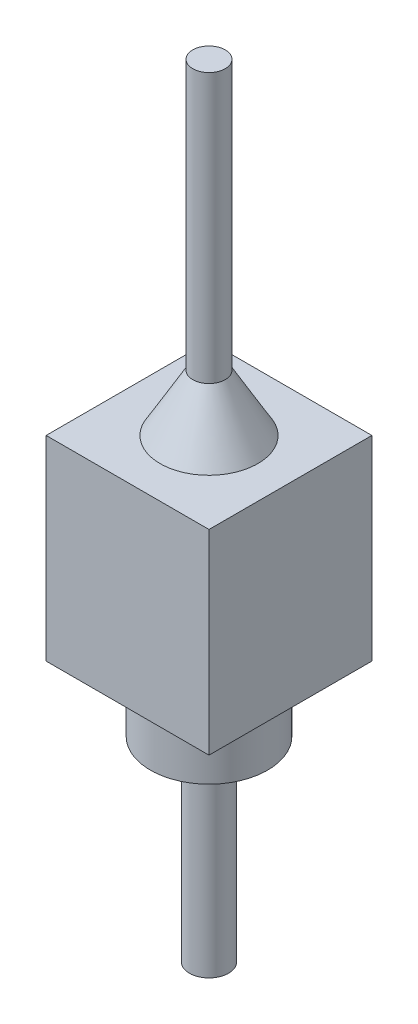
ISO-10303-21;
HEADER;
FILE_DESCRIPTION(('STEP AP214'),'2;1');
FILE_NAME('part.step','',(''),(''),'','','');
FILE_SCHEMA(('AUTOMOTIVE_DESIGN { 1 0 10303 214 1 1 1 1 }'));
ENDSEC;
DATA;
#1=APPLICATION_CONTEXT('core data for automotive mechanical design processes');
#2=APPLICATION_PROTOCOL_DEFINITION('international standard','automotive_design',2000,#1);
#3=PRODUCT_CONTEXT('',#1,'mechanical');
#4=PRODUCT('Part','Part','',(#3));
#5=PRODUCT_RELATED_PRODUCT_CATEGORY('part','',(#4));
#6=PRODUCT_DEFINITION_FORMATION('','',#4);
#7=PRODUCT_DEFINITION_CONTEXT('part definition',#1,'design');
#8=PRODUCT_DEFINITION('design','',#6,#7);
#9=PRODUCT_DEFINITION_SHAPE('','',#8);
#10=(LENGTH_UNIT() NAMED_UNIT(*) SI_UNIT(.MILLI.,.METRE.));
#11=(NAMED_UNIT(*) PLANE_ANGLE_UNIT() SI_UNIT($,.RADIAN.));
#12=(NAMED_UNIT(*) SI_UNIT($,.STERADIAN.) SOLID_ANGLE_UNIT());
#13=UNCERTAINTY_MEASURE_WITH_UNIT(LENGTH_MEASURE(1.E-05),#10,'distance_accuracy_value','');
#14=(GEOMETRIC_REPRESENTATION_CONTEXT(3) GLOBAL_UNCERTAINTY_ASSIGNED_CONTEXT((#13)) GLOBAL_UNIT_ASSIGNED_CONTEXT((#10,
#11,#12)) REPRESENTATION_CONTEXT('',''));
#15=CARTESIAN_POINT('',(0.,0.,0.));
#16=DIRECTION('',(0.,0.,1.));
#17=DIRECTION('',(1.,0.,0.));
#18=AXIS2_PLACEMENT_3D('',#15,#16,#17);
#19=CARTESIAN_POINT('',(-1.25,3.,-1.25));
#20=DIRECTION('',(1.,0.,0.));
#21=DIRECTION('',(0.,0.,-1.));
#22=AXIS2_PLACEMENT_3D('',#19,#20,#21);
#23=PLANE('',#22);
#24=DIRECTION('',(0.,0.,1.));
#25=VECTOR('',#24,1.);
#26=CARTESIAN_POINT('',(-1.25,0.,-1.25));
#27=LINE('',#26,#25);
#28=CARTESIAN_POINT('',(-1.25,0.,-1.25));
#29=VERTEX_POINT('',#28);
#30=CARTESIAN_POINT('',(-1.25,0.,1.25));
#31=VERTEX_POINT('',#30);
#32=EDGE_CURVE('E103',#29,#31,#27,.T.);
#33=ORIENTED_EDGE('',*,*,#32,.T.);
#34=DIRECTION('',(0.,-1.,0.));
#35=VECTOR('',#34,1.);
#36=CARTESIAN_POINT('',(-1.25,3.,1.25));
#37=LINE('',#36,#35);
#38=CARTESIAN_POINT('',(-1.25,3.,1.25));
#39=VERTEX_POINT('',#38);
#40=EDGE_CURVE('E94',#39,#31,#37,.T.);
#41=ORIENTED_EDGE('',*,*,#40,.F.);
#42=DIRECTION('',(0.,0.,1.));
#43=VECTOR('',#42,1.);
#44=CARTESIAN_POINT('',(-1.25,3.,-1.25));
#45=LINE('',#44,#43);
#46=CARTESIAN_POINT('',(-1.25,3.,-1.25));
#47=VERTEX_POINT('',#46);
#48=EDGE_CURVE('E88',#47,#39,#45,.T.);
#49=ORIENTED_EDGE('',*,*,#48,.F.);
#50=DIRECTION('',(0.,-1.,0.));
#51=VECTOR('',#50,1.);
#52=CARTESIAN_POINT('',(-1.25,3.,-1.25));
#53=LINE('',#52,#51);
#54=EDGE_CURVE('E99',#47,#29,#53,.T.);
#55=ORIENTED_EDGE('',*,*,#54,.T.);
#56=EDGE_LOOP('',(#33,#41,#49,#55));
#57=FACE_BOUND('',#56,.T.);
#58=ADVANCED_FACE('F35',(#57),#23,.F.);
#59=CARTESIAN_POINT('',(1.25,3.,1.25));
#60=DIRECTION('',(0.,0.,-1.));
#61=DIRECTION('',(-1.,0.,0.));
#62=AXIS2_PLACEMENT_3D('',#59,#60,#61);
#63=PLANE('',#62);
#64=DIRECTION('',(1.,0.,0.));
#65=VECTOR('',#64,1.);
#66=CARTESIAN_POINT('',(1.25,0.,1.25));
#67=LINE('',#66,#65);
#68=CARTESIAN_POINT('',(1.25,0.,1.25));
#69=VERTEX_POINT('',#68);
#70=EDGE_CURVE('E93',#31,#69,#67,.T.);
#71=ORIENTED_EDGE('',*,*,#70,.T.);
#72=DIRECTION('',(0.,-1.,0.));
#73=VECTOR('',#72,1.);
#74=CARTESIAN_POINT('',(1.25,3.,1.25));
#75=LINE('',#74,#73);
#76=CARTESIAN_POINT('',(1.25,3.,1.25));
#77=VERTEX_POINT('',#76);
#78=EDGE_CURVE('E91',#77,#69,#75,.T.);
#79=ORIENTED_EDGE('',*,*,#78,.F.);
#80=DIRECTION('',(1.,0.,0.));
#81=VECTOR('',#80,1.);
#82=CARTESIAN_POINT('',(1.25,3.,1.25));
#83=LINE('',#82,#81);
#84=EDGE_CURVE('E83',#39,#77,#83,.T.);
#85=ORIENTED_EDGE('',*,*,#84,.F.);
#86=ORIENTED_EDGE('',*,*,#40,.T.);
#87=EDGE_LOOP('',(#71,#79,#85,#86));
#88=FACE_BOUND('',#87,.T.);
#89=ADVANCED_FACE('F92',(#88),#63,.F.);
#90=CARTESIAN_POINT('',(1.25,3.,-1.25));
#91=DIRECTION('',(-1.,0.,0.));
#92=DIRECTION('',(0.,0.,1.));
#93=AXIS2_PLACEMENT_3D('',#90,#91,#92);
#94=PLANE('',#93);
#95=DIRECTION('',(0.,0.,-1.));
#96=VECTOR('',#95,1.);
#97=CARTESIAN_POINT('',(1.25,0.,-1.25));
#98=LINE('',#97,#96);
#99=CARTESIAN_POINT('',(1.25,0.,-1.25));
#100=VERTEX_POINT('',#99);
#101=EDGE_CURVE('E69',#69,#100,#98,.T.);
#102=ORIENTED_EDGE('',*,*,#101,.T.);
#103=DIRECTION('',(0.,-1.,0.));
#104=VECTOR('',#103,1.);
#105=CARTESIAN_POINT('',(1.25,3.,-1.25));
#106=LINE('',#105,#104);
#107=CARTESIAN_POINT('',(1.25,3.,-1.25));
#108=VERTEX_POINT('',#107);
#109=EDGE_CURVE('E95',#108,#100,#106,.T.);
#110=ORIENTED_EDGE('',*,*,#109,.F.);
#111=DIRECTION('',(0.,0.,-1.));
#112=VECTOR('',#111,1.);
#113=CARTESIAN_POINT('',(1.25,3.,-1.25));
#114=LINE('',#113,#112);
#115=EDGE_CURVE('E86',#77,#108,#114,.T.);
#116=ORIENTED_EDGE('',*,*,#115,.F.);
#117=ORIENTED_EDGE('',*,*,#78,.T.);
#118=EDGE_LOOP('',(#102,#110,#116,#117));
#119=FACE_BOUND('',#118,.T.);
#120=ADVANCED_FACE('F97',(#119),#94,.F.);
#121=CARTESIAN_POINT('',(1.25,3.,-1.25));
#122=DIRECTION('',(0.,0.,1.));
#123=DIRECTION('',(1.,0.,0.));
#124=AXIS2_PLACEMENT_3D('',#121,#122,#123);
#125=PLANE('',#124);
#126=DIRECTION('',(-1.,0.,0.));
#127=VECTOR('',#126,1.);
#128=CARTESIAN_POINT('',(1.25,0.,-1.25));
#129=LINE('',#128,#127);
#130=EDGE_CURVE('E75',#100,#29,#129,.T.);
#131=ORIENTED_EDGE('',*,*,#130,.T.);
#132=ORIENTED_EDGE('',*,*,#54,.F.);
#133=DIRECTION('',(-1.,0.,0.));
#134=VECTOR('',#133,1.);
#135=CARTESIAN_POINT('',(1.25,3.,-1.25));
#136=LINE('',#135,#134);
#137=EDGE_CURVE('E52',#108,#47,#136,.T.);
#138=ORIENTED_EDGE('',*,*,#137,.F.);
#139=ORIENTED_EDGE('',*,*,#109,.T.);
#140=EDGE_LOOP('',(#131,#132,#138,#139));
#141=FACE_BOUND('',#140,.T.);
#142=ADVANCED_FACE('F159',(#141),#125,.F.);
#143=CARTESIAN_POINT('',(0.,3.,0.));
#144=DIRECTION('',(0.,-1.,0.));
#145=DIRECTION('',(0.,0.,-1.));
#146=AXIS2_PLACEMENT_3D('',#143,#144,#145);
#147=PLANE('',#146);
#148=CARTESIAN_POINT('',(0.,3.,0.));
#149=DIRECTION('',(0.,-1.,0.));
#150=DIRECTION('',(0.,0.,-1.));
#151=AXIS2_PLACEMENT_3D('',#148,#149,#150);
#152=CIRCLE('',#151,0.749999999999998);
#153=CARTESIAN_POINT('',(0.,3.,-0.749999999999998));
#154=VERTEX_POINT('',#153);
#155=EDGE_CURVE('E11',#154,#154,#152,.T.);
#156=ORIENTED_EDGE('',*,*,#155,.T.);
#157=EDGE_LOOP('',(#156));
#158=FACE_BOUND('',#157,.T.);
#159=ORIENTED_EDGE('',*,*,#48,.T.);
#160=ORIENTED_EDGE('',*,*,#84,.T.);
#161=ORIENTED_EDGE('',*,*,#115,.T.);
#162=ORIENTED_EDGE('',*,*,#137,.T.);
#163=EDGE_LOOP('',(#159,#160,#161,#162));
#164=FACE_BOUND('',#163,.T.);
#165=ADVANCED_FACE('F84',(#158,#164),#147,.F.);
#166=CARTESIAN_POINT('',(0.,0.,0.));
#167=DIRECTION('',(0.,-1.,0.));
#168=DIRECTION('',(0.,0.,-1.));
#169=AXIS2_PLACEMENT_3D('',#166,#167,#168);
#170=PLANE('',#169);
#171=CARTESIAN_POINT('',(0.,0.,0.));
#172=DIRECTION('',(0.,-1.,0.));
#173=DIRECTION('',(0.,0.,-1.));
#174=AXIS2_PLACEMENT_3D('',#171,#172,#173);
#175=CIRCLE('',#174,0.9);
#176=CARTESIAN_POINT('',(0.,0.,-0.9));
#177=VERTEX_POINT('',#176);
#178=EDGE_CURVE('E112',#177,#177,#175,.T.);
#179=ORIENTED_EDGE('',*,*,#178,.F.);
#180=EDGE_LOOP('',(#179));
#181=FACE_BOUND('',#180,.T.);
#182=ORIENTED_EDGE('',*,*,#32,.F.);
#183=ORIENTED_EDGE('',*,*,#130,.F.);
#184=ORIENTED_EDGE('',*,*,#101,.F.);
#185=ORIENTED_EDGE('',*,*,#70,.F.);
#186=EDGE_LOOP('',(#182,#183,#184,#185));
#187=FACE_BOUND('',#186,.T.);
#188=ADVANCED_FACE('F162',(#181,#187),#170,.T.);
#189=CARTESIAN_POINT('',(0.,-1.,0.));
#190=DIRECTION('',(0.,1.,0.));
#191=DIRECTION('',(0.,0.,1.));
#192=AXIS2_PLACEMENT_3D('',#189,#190,#191);
#193=CYLINDRICAL_SURFACE('',#192,0.9);
#194=CARTESIAN_POINT('',(0.,-1.,0.));
#195=DIRECTION('',(0.,-1.,0.));
#196=DIRECTION('',(0.,0.,-1.));
#197=AXIS2_PLACEMENT_3D('',#194,#195,#196);
#198=CIRCLE('',#197,0.9);
#199=CARTESIAN_POINT('',(0.,-1.,-0.9));
#200=VERTEX_POINT('',#199);
#201=EDGE_CURVE('E106',#200,#200,#198,.T.);
#202=ORIENTED_EDGE('',*,*,#201,.F.);
#203=EDGE_LOOP('',(#202));
#204=FACE_BOUND('',#203,.T.);
#205=ORIENTED_EDGE('',*,*,#178,.T.);
#206=EDGE_LOOP('',(#205));
#207=FACE_BOUND('',#206,.T.);
#208=ADVANCED_FACE('F165',(#204,#207),#193,.T.);
#209=CARTESIAN_POINT('',(0.,-1.,0.));
#210=DIRECTION('',(0.,-1.,0.));
#211=DIRECTION('',(0.,0.,-1.));
#212=AXIS2_PLACEMENT_3D('',#209,#210,#211);
#213=PLANE('',#212);
#214=CARTESIAN_POINT('',(0.,-1.,0.));
#215=DIRECTION('',(0.,-1.,0.));
#216=DIRECTION('',(0.,0.,-1.));
#217=AXIS2_PLACEMENT_3D('',#214,#215,#216);
#218=CIRCLE('',#217,0.3);
#219=CARTESIAN_POINT('',(0.,-1.,-0.3));
#220=VERTEX_POINT('',#219);
#221=EDGE_CURVE('E114',#220,#220,#218,.T.);
#222=ORIENTED_EDGE('',*,*,#221,.F.);
#223=EDGE_LOOP('',(#222));
#224=FACE_BOUND('',#223,.T.);
#225=ORIENTED_EDGE('',*,*,#201,.T.);
#226=EDGE_LOOP('',(#225));
#227=FACE_BOUND('',#226,.T.);
#228=ADVANCED_FACE('F172',(#224,#227),#213,.T.);
#229=CARTESIAN_POINT('',(0.,-4.,0.));
#230=DIRECTION('',(0.,1.,0.));
#231=DIRECTION('',(0.,0.,1.));
#232=AXIS2_PLACEMENT_3D('',#229,#230,#231);
#233=CYLINDRICAL_SURFACE('',#232,0.3);
#234=CARTESIAN_POINT('',(0.,-4.,0.));
#235=DIRECTION('',(0.,-1.,0.));
#236=DIRECTION('',(0.,0.,-1.));
#237=AXIS2_PLACEMENT_3D('',#234,#235,#236);
#238=CIRCLE('',#237,0.3);
#239=CARTESIAN_POINT('',(0.,-4.,-0.3));
#240=VERTEX_POINT('',#239);
#241=EDGE_CURVE('E125',#240,#240,#238,.T.);
#242=ORIENTED_EDGE('',*,*,#241,.F.);
#243=EDGE_LOOP('',(#242));
#244=FACE_BOUND('',#243,.T.);
#245=ORIENTED_EDGE('',*,*,#221,.T.);
#246=EDGE_LOOP('',(#245));
#247=FACE_BOUND('',#246,.T.);
#248=ADVANCED_FACE('F148',(#244,#247),#233,.T.);
#249=CARTESIAN_POINT('',(0.,-4.,0.));
#250=DIRECTION('',(0.,-1.,0.));
#251=DIRECTION('',(0.,0.,-1.));
#252=AXIS2_PLACEMENT_3D('',#249,#250,#251);
#253=PLANE('',#252);
#254=ORIENTED_EDGE('',*,*,#241,.T.);
#255=EDGE_LOOP('',(#254));
#256=FACE_BOUND('',#255,.T.);
#257=ADVANCED_FACE('F141',(#256),#253,.T.);
#258=CARTESIAN_POINT('',(0.,8.,0.));
#259=DIRECTION('',(0.,-1.,0.));
#260=DIRECTION('',(0.,0.,-1.));
#261=AXIS2_PLACEMENT_3D('',#258,#259,#260);
#262=CYLINDRICAL_SURFACE('',#261,0.25);
#263=CARTESIAN_POINT('',(0.,3.86602540378445,0.));
#264=DIRECTION('',(0.,-1.,0.));
#265=DIRECTION('',(0.,0.,-1.));
#266=AXIS2_PLACEMENT_3D('',#263,#264,#265);
#267=CIRCLE('',#266,0.25);
#268=CARTESIAN_POINT('',(0.,3.86602540378445,-0.25));
#269=VERTEX_POINT('',#268);
#270=EDGE_CURVE('E44',#269,#269,#267,.F.);
#271=ORIENTED_EDGE('',*,*,#270,.T.);
#272=EDGE_LOOP('',(#271));
#273=FACE_BOUND('',#272,.T.);
#274=CARTESIAN_POINT('',(0.,8.,0.));
#275=DIRECTION('',(0.,1.,0.));
#276=DIRECTION('',(0.,0.,1.));
#277=AXIS2_PLACEMENT_3D('',#274,#275,#276);
#278=CIRCLE('',#277,0.25);
#279=CARTESIAN_POINT('',(0.,8.,0.25));
#280=VERTEX_POINT('',#279);
#281=EDGE_CURVE('E131',#280,#280,#278,.T.);
#282=ORIENTED_EDGE('',*,*,#281,.F.);
#283=EDGE_LOOP('',(#282));
#284=FACE_BOUND('',#283,.T.);
#285=ADVANCED_FACE('F139',(#273,#284),#262,.T.);
#286=CARTESIAN_POINT('',(0.,8.,0.));
#287=DIRECTION('',(0.,1.,0.));
#288=DIRECTION('',(0.,0.,1.));
#289=AXIS2_PLACEMENT_3D('',#286,#287,#288);
#290=PLANE('',#289);
#291=ORIENTED_EDGE('',*,*,#281,.T.);
#292=EDGE_LOOP('',(#291));
#293=FACE_BOUND('',#292,.T.);
#294=ADVANCED_FACE('F137',(#293),#290,.T.);
#295=CARTESIAN_POINT('',(0.,3.86602540378445,0.));
#296=DIRECTION('',(0.,-1.,0.));
#297=DIRECTION('',(0.,0.,-1.));
#298=AXIS2_PLACEMENT_3D('',#295,#296,#297);
#299=CONICAL_SURFACE('',#298,0.25,0.523598775598293);
#300=CARTESIAN_POINT('',(0.,3.,-0.749999999999998));
#301=CARTESIAN_POINT('',(0.,3.00902109795609,-0.744791666666665));
#302=CARTESIAN_POINT('',(0.,3.01804219591218,-0.739583333333331));
#303=CARTESIAN_POINT('',(0.,3.03608439182435,-0.729166666666665));
#304=CARTESIAN_POINT('',(0.,3.04510548978044,-0.723958333333331));
#305=CARTESIAN_POINT('',(0.,3.06314768569262,-0.713541666666665));
#306=CARTESIAN_POINT('',(0.,3.0721687836487,-0.708333333333331));
#307=CARTESIAN_POINT('',(0.,3.09021097956088,-0.697916666666665));
#308=CARTESIAN_POINT('',(0.,3.09923207751697,-0.692708333333331));
#309=CARTESIAN_POINT('',(0.,3.11727427342914,-0.682291666666665));
#310=CARTESIAN_POINT('',(0.,3.12629537138523,-0.677083333333332));
#311=CARTESIAN_POINT('',(0.,3.14433756729741,-0.666666666666665));
#312=CARTESIAN_POINT('',(0.,3.1533586652535,-0.661458333333331));
#313=CARTESIAN_POINT('',(0.,3.17140086116567,-0.651041666666665));
#314=CARTESIAN_POINT('',(0.,3.18042195912176,-0.645833333333332));
#315=CARTESIAN_POINT('',(0.,3.19846415503394,-0.635416666666665));
#316=CARTESIAN_POINT('',(0.,3.20748525299002,-0.630208333333332));
#317=CARTESIAN_POINT('',(0.,3.2255274489022,-0.619791666666665));
#318=CARTESIAN_POINT('',(0.,3.23454854685829,-0.614583333333332));
#319=CARTESIAN_POINT('',(0.,3.25259074277046,-0.604166666666665));
#320=CARTESIAN_POINT('',(0.,3.26161184072655,-0.598958333333332));
#321=CARTESIAN_POINT('',(0.,3.27965403663873,-0.588541666666665));
#322=CARTESIAN_POINT('',(0.,3.28867513459482,-0.583333333333332));
#323=CARTESIAN_POINT('',(0.,3.30671733050699,-0.572916666666665));
#324=CARTESIAN_POINT('',(0.,3.31573842846308,-0.567708333333332));
#325=CARTESIAN_POINT('',(0.,3.33378062437526,-0.557291666666665));
#326=CARTESIAN_POINT('',(0.,3.34280172233134,-0.552083333333332));
#327=CARTESIAN_POINT('',(0.,3.36084391824352,-0.541666666666665));
#328=CARTESIAN_POINT('',(0.,3.36986501619961,-0.536458333333332));
#329=CARTESIAN_POINT('',(0.,3.38790721211178,-0.526041666666665));
#330=CARTESIAN_POINT('',(0.,3.39692831006787,-0.520833333333332));
#331=CARTESIAN_POINT('',(0.,3.41497050598005,-0.510416666666666));
#332=CARTESIAN_POINT('',(0.,3.42399160393614,-0.505208333333332));
#333=CARTESIAN_POINT('',(0.,3.44203379984831,-0.494791666666666));
#334=CARTESIAN_POINT('',(0.,3.4510548978044,-0.489583333333332));
#335=CARTESIAN_POINT('',(0.,3.46909709371658,-0.479166666666666));
#336=CARTESIAN_POINT('',(0.,3.47811819167266,-0.473958333333332));
#337=CARTESIAN_POINT('',(0.,3.49616038758484,-0.463541666666666));
#338=CARTESIAN_POINT('',(0.,3.50518148554093,-0.458333333333332));
#339=CARTESIAN_POINT('',(0.,3.5232236814531,-0.447916666666666));
#340=CARTESIAN_POINT('',(0.,3.53224477940919,-0.442708333333332));
#341=CARTESIAN_POINT('',(0.,3.55028697532137,-0.432291666666666));
#342=CARTESIAN_POINT('',(0.,3.55930807327746,-0.427083333333333));
#343=CARTESIAN_POINT('',(0.,3.57735026918963,-0.416666666666666));
#344=CARTESIAN_POINT('',(0.,3.58637136714572,-0.411458333333333));
#345=CARTESIAN_POINT('',(0.,3.6044135630579,-0.401041666666666));
#346=CARTESIAN_POINT('',(0.,3.61343466101398,-0.395833333333333));
#347=CARTESIAN_POINT('',(0.,3.63147685692616,-0.385416666666666));
#348=CARTESIAN_POINT('',(0.,3.64049795488225,-0.380208333333333));
#349=CARTESIAN_POINT('',(0.,3.65854015079442,-0.369791666666666));
#350=CARTESIAN_POINT('',(0.,3.66756124875051,-0.364583333333333));
#351=CARTESIAN_POINT('',(0.,3.68560344466269,-0.354166666666666));
#352=CARTESIAN_POINT('',(0.,3.69462454261878,-0.348958333333333));
#353=CARTESIAN_POINT('',(0.,3.71266673853095,-0.338541666666666));
#354=CARTESIAN_POINT('',(0.,3.72168783648704,-0.333333333333333));
#355=CARTESIAN_POINT('',(0.,3.73973003239922,-0.322916666666666));
#356=CARTESIAN_POINT('',(0.,3.7487511303553,-0.317708333333333));
#357=CARTESIAN_POINT('',(0.,3.76679332626748,-0.307291666666666));
#358=CARTESIAN_POINT('',(0.,3.77581442422357,-0.302083333333333));
#359=CARTESIAN_POINT('',(0.,3.79385662013574,-0.291666666666666));
#360=CARTESIAN_POINT('',(0.,3.80287771809183,-0.286458333333333));
#361=CARTESIAN_POINT('',(0.,3.82091991400401,-0.276041666666666));
#362=CARTESIAN_POINT('',(0.,3.8299410119601,-0.270833333333333));
#363=CARTESIAN_POINT('',(0.,3.84798320787227,-0.260416666666667));
#364=CARTESIAN_POINT('',(0.,3.85700430582836,-0.255208333333333));
#365=CARTESIAN_POINT('',(0.,3.86602540378445,-0.25));
#366=B_SPLINE_CURVE_WITH_KNOTS('',3,(#300,#301,#302,#303,#304,#305,#306,#307,#308,#309,#310,
#311,#312,#313,#314,#315,#316,#317,#318,#319,#320,#321,#322,#323,#324,#325,#326,#327,#328,#329,
#330,#331,#332,#333,#334,#335,#336,#337,#338,#339,#340,#341,#342,#343,#344,#345,#346,#347,#348,
#349,#350,#351,#352,#353,#354,#355,#356,#357,#358,#359,#360,#361,#362,#363,#364,#365),
.UNSPECIFIED.,.F.,.F.,(4,2,2,2,2,2,2,2,2,2,2,2,2,2,2,2,2,2,2,2,2,2,2,2,2,2,2,2,2,2,2,2,4),(0.,
0.0312500000000004,0.0625000000000006,0.0937500000000011,0.125000000000001,0.156250000000001,
0.187500000000001,0.218750000000002,0.250000000000002,0.281250000000002,0.312500000000002,
0.343750000000003,0.375000000000003,0.406250000000003,0.437500000000003,0.468750000000003,
0.500000000000004,0.531250000000004,0.562500000000004,0.593750000000004,0.625000000000004,
0.656250000000004,0.687500000000005,0.718750000000005,0.750000000000005,0.781250000000005,
0.812500000000005,0.843750000000006,0.875000000000006,0.906250000000006,0.937500000000006,
0.968750000000006,1.00000000000001),.UNSPECIFIED.);
#367=EDGE_CURVE('BSEAM37',#154,#269,#366,.T.);
#368=ORIENTED_EDGE('',*,*,#155,.F.);
#369=ORIENTED_EDGE('',*,*,#270,.F.);
#370=ORIENTED_EDGE('',*,*,#367,.T.);
#371=ORIENTED_EDGE('',*,*,#367,.F.);
#372=EDGE_LOOP('',(#368,#370,#369,#371));
#373=FACE_BOUND('',#372,.T.);
#374=ADVANCED_FACE('F37',(#373),#299,.T.);
#375=CLOSED_SHELL('',(#58,#89,#120,#142,#165,#188,#208,#228,#248,#257,#285,#294,#374));
#376=MANIFOLD_SOLID_BREP('B2',#375);
#377=ADVANCED_BREP_SHAPE_REPRESENTATION('',(#18,#376),#14);
#378=SHAPE_DEFINITION_REPRESENTATION(#9,#377);
ENDSEC;
END-ISO-10303-21;
